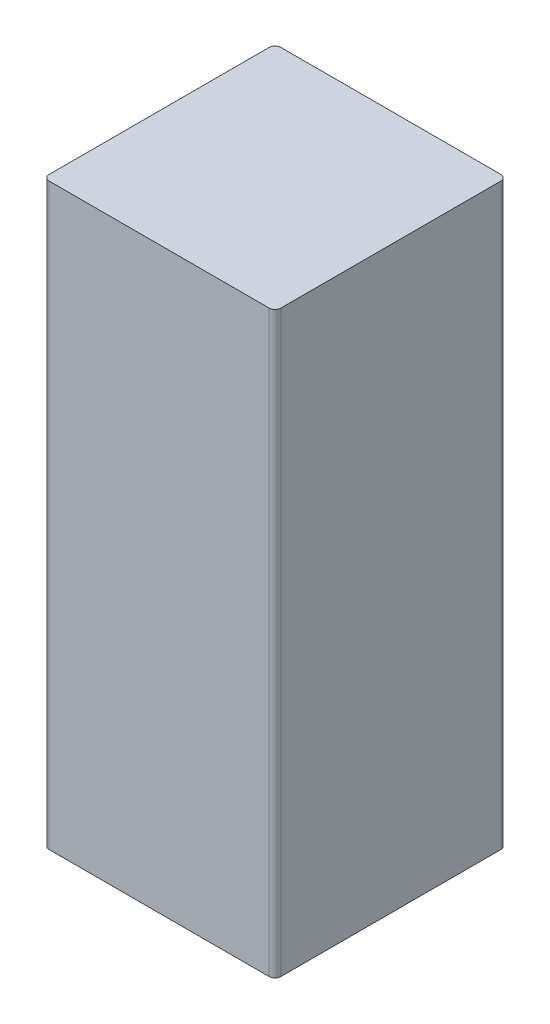
ISO-10303-21;
HEADER;
FILE_DESCRIPTION(('STEP AP214'),'2;1');
FILE_NAME('part.step','',(''),(''),'','','');
FILE_SCHEMA(('AUTOMOTIVE_DESIGN { 1 0 10303 214 1 1 1 1 }'));
ENDSEC;
DATA;
#1=APPLICATION_CONTEXT('core data for automotive mechanical design processes');
#2=APPLICATION_PROTOCOL_DEFINITION('international standard','automotive_design',2000,#1);
#3=PRODUCT_CONTEXT('',#1,'mechanical');
#4=PRODUCT('Part','Part','',(#3));
#5=PRODUCT_RELATED_PRODUCT_CATEGORY('part','',(#4));
#6=PRODUCT_DEFINITION_FORMATION('','',#4);
#7=PRODUCT_DEFINITION_CONTEXT('part definition',#1,'design');
#8=PRODUCT_DEFINITION('design','',#6,#7);
#9=PRODUCT_DEFINITION_SHAPE('','',#8);
#10=(LENGTH_UNIT() NAMED_UNIT(*) SI_UNIT(.MILLI.,.METRE.));
#11=(NAMED_UNIT(*) PLANE_ANGLE_UNIT() SI_UNIT($,.RADIAN.));
#12=(NAMED_UNIT(*) SI_UNIT($,.STERADIAN.) SOLID_ANGLE_UNIT());
#13=UNCERTAINTY_MEASURE_WITH_UNIT(LENGTH_MEASURE(1.E-05),#10,'distance_accuracy_value','');
#14=(GEOMETRIC_REPRESENTATION_CONTEXT(3) GLOBAL_UNCERTAINTY_ASSIGNED_CONTEXT((#13)) GLOBAL_UNIT_ASSIGNED_CONTEXT((#10,
#11,#12)) REPRESENTATION_CONTEXT('',''));
#15=CARTESIAN_POINT('',(0.,0.,0.));
#16=DIRECTION('',(0.,0.,1.));
#17=DIRECTION('',(1.,0.,0.));
#18=AXIS2_PLACEMENT_3D('',#15,#16,#17);
#19=CARTESIAN_POINT('',(1.90000000000002,10.,1.89999999999999));
#20=DIRECTION('',(0.,-1.,0.));
#21=DIRECTION('',(0.,0.,-1.));
#22=AXIS2_PLACEMENT_3D('',#19,#20,#21);
#23=CYLINDRICAL_SURFACE('',#22,0.1);
#24=CARTESIAN_POINT('',(1.90000000000002,0.,1.89999999999999));
#25=DIRECTION('',(0.,1.,0.));
#26=DIRECTION('',(0.,0.,1.));
#27=AXIS2_PLACEMENT_3D('',#24,#25,#26);
#28=CIRCLE('',#27,0.1);
#29=CARTESIAN_POINT('',(1.90000000000002,0.,1.99999999999999));
#30=VERTEX_POINT('',#29);
#31=CARTESIAN_POINT('',(2.00000000000002,0.,1.89999999999999));
#32=VERTEX_POINT('',#31);
#33=EDGE_CURVE('E140',#30,#32,#28,.T.);
#34=ORIENTED_EDGE('',*,*,#33,.T.);
#35=DIRECTION('',(0.,-1.,0.));
#36=VECTOR('',#35,1.);
#37=CARTESIAN_POINT('',(2.00000000000002,10.,1.89999999999999));
#38=LINE('',#37,#36);
#39=CARTESIAN_POINT('',(2.00000000000002,10.,1.89999999999999));
#40=VERTEX_POINT('',#39);
#41=EDGE_CURVE('E11',#40,#32,#38,.T.);
#42=ORIENTED_EDGE('',*,*,#41,.F.);
#43=CARTESIAN_POINT('',(1.90000000000002,10.,1.89999999999999));
#44=DIRECTION('',(0.,1.,0.));
#45=DIRECTION('',(0.,0.,1.));
#46=AXIS2_PLACEMENT_3D('',#43,#44,#45);
#47=CIRCLE('',#46,0.1);
#48=CARTESIAN_POINT('',(1.90000000000002,10.,1.99999999999999));
#49=VERTEX_POINT('',#48);
#50=EDGE_CURVE('E162',#49,#40,#47,.T.);
#51=ORIENTED_EDGE('',*,*,#50,.F.);
#52=DIRECTION('',(0.,-1.,0.));
#53=VECTOR('',#52,1.);
#54=CARTESIAN_POINT('',(1.90000000000002,10.,1.99999999999999));
#55=LINE('',#54,#53);
#56=EDGE_CURVE('E136',#49,#30,#55,.T.);
#57=ORIENTED_EDGE('',*,*,#56,.T.);
#58=EDGE_LOOP('',(#34,#42,#51,#57));
#59=FACE_BOUND('',#58,.T.);
#60=ADVANCED_FACE('F39',(#59),#23,.T.);
#61=CARTESIAN_POINT('',(2.00000000000002,10.,1.89999999999999));
#62=DIRECTION('',(-1.,0.,0.));
#63=DIRECTION('',(0.,0.,1.));
#64=AXIS2_PLACEMENT_3D('',#61,#62,#63);
#65=PLANE('',#64);
#66=DIRECTION('',(0.,0.,-1.));
#67=VECTOR('',#66,1.);
#68=CARTESIAN_POINT('',(2.00000000000002,0.,1.89999999999999));
#69=LINE('',#68,#67);
#70=CARTESIAN_POINT('',(2.00000000000002,0.,-1.90000000000001));
#71=VERTEX_POINT('',#70);
#72=EDGE_CURVE('E144',#32,#71,#69,.T.);
#73=ORIENTED_EDGE('',*,*,#72,.T.);
#74=DIRECTION('',(0.,-1.,0.));
#75=VECTOR('',#74,1.);
#76=CARTESIAN_POINT('',(2.00000000000002,10.,-1.90000000000001));
#77=LINE('',#76,#75);
#78=CARTESIAN_POINT('',(2.00000000000002,10.,-1.90000000000001));
#79=VERTEX_POINT('',#78);
#80=EDGE_CURVE('E48',#79,#71,#77,.T.);
#81=ORIENTED_EDGE('',*,*,#80,.F.);
#82=DIRECTION('',(0.,0.,-1.));
#83=VECTOR('',#82,1.);
#84=CARTESIAN_POINT('',(2.00000000000002,10.,1.89999999999999));
#85=LINE('',#84,#83);
#86=EDGE_CURVE('E99',#40,#79,#85,.T.);
#87=ORIENTED_EDGE('',*,*,#86,.F.);
#88=ORIENTED_EDGE('',*,*,#41,.T.);
#89=EDGE_LOOP('',(#73,#81,#87,#88));
#90=FACE_BOUND('',#89,.T.);
#91=ADVANCED_FACE('F208',(#90),#65,.F.);
#92=CARTESIAN_POINT('',(1.90000000000002,10.,-1.90000000000001));
#93=DIRECTION('',(0.,-1.,0.));
#94=DIRECTION('',(0.,0.,-1.));
#95=AXIS2_PLACEMENT_3D('',#92,#93,#94);
#96=CYLINDRICAL_SURFACE('',#95,0.1);
#97=CARTESIAN_POINT('',(1.90000000000002,0.,-1.90000000000001));
#98=DIRECTION('',(0.,1.,0.));
#99=DIRECTION('',(0.,0.,-1.));
#100=AXIS2_PLACEMENT_3D('',#97,#98,#99);
#101=CIRCLE('',#100,0.1);
#102=CARTESIAN_POINT('',(1.90000000000002,0.,-2.00000000000001));
#103=VERTEX_POINT('',#102);
#104=EDGE_CURVE('E147',#71,#103,#101,.T.);
#105=ORIENTED_EDGE('',*,*,#104,.T.);
#106=DIRECTION('',(0.,-1.,0.));
#107=VECTOR('',#106,1.);
#108=CARTESIAN_POINT('',(1.90000000000002,10.,-2.00000000000001));
#109=LINE('',#108,#107);
#110=CARTESIAN_POINT('',(1.90000000000002,10.,-2.00000000000001));
#111=VERTEX_POINT('',#110);
#112=EDGE_CURVE('E173',#111,#103,#109,.T.);
#113=ORIENTED_EDGE('',*,*,#112,.F.);
#114=CARTESIAN_POINT('',(1.90000000000002,10.,-1.90000000000001));
#115=DIRECTION('',(0.,1.,0.));
#116=DIRECTION('',(0.,0.,-1.));
#117=AXIS2_PLACEMENT_3D('',#114,#115,#116);
#118=CIRCLE('',#117,0.1);
#119=EDGE_CURVE('E183',#79,#111,#118,.T.);
#120=ORIENTED_EDGE('',*,*,#119,.F.);
#121=ORIENTED_EDGE('',*,*,#80,.T.);
#122=EDGE_LOOP('',(#105,#113,#120,#121));
#123=FACE_BOUND('',#122,.T.);
#124=ADVANCED_FACE('F181',(#123),#96,.T.);
#125=CARTESIAN_POINT('',(-1.89999999999998,10.,-2.00000000000001));
#126=DIRECTION('',(0.,0.,1.));
#127=DIRECTION('',(1.,0.,0.));
#128=AXIS2_PLACEMENT_3D('',#125,#126,#127);
#129=PLANE('',#128);
#130=DIRECTION('',(-1.,0.,0.));
#131=VECTOR('',#130,1.);
#132=CARTESIAN_POINT('',(-1.89999999999998,0.,-2.00000000000001));
#133=LINE('',#132,#131);
#134=CARTESIAN_POINT('',(-1.89999999999998,0.,-2.00000000000001));
#135=VERTEX_POINT('',#134);
#136=EDGE_CURVE('E150',#103,#135,#133,.T.);
#137=ORIENTED_EDGE('',*,*,#136,.T.);
#138=DIRECTION('',(0.,-1.,0.));
#139=VECTOR('',#138,1.);
#140=CARTESIAN_POINT('',(-1.89999999999998,10.,-2.00000000000001));
#141=LINE('',#140,#139);
#142=CARTESIAN_POINT('',(-1.89999999999998,10.,-2.00000000000001));
#143=VERTEX_POINT('',#142);
#144=EDGE_CURVE('E169',#143,#135,#141,.T.);
#145=ORIENTED_EDGE('',*,*,#144,.F.);
#146=DIRECTION('',(-1.,0.,0.));
#147=VECTOR('',#146,1.);
#148=CARTESIAN_POINT('',(-1.89999999999998,10.,-2.00000000000001));
#149=LINE('',#148,#147);
#150=EDGE_CURVE('E196',#111,#143,#149,.T.);
#151=ORIENTED_EDGE('',*,*,#150,.F.);
#152=ORIENTED_EDGE('',*,*,#112,.T.);
#153=EDGE_LOOP('',(#137,#145,#151,#152));
#154=FACE_BOUND('',#153,.T.);
#155=ADVANCED_FACE('F191',(#154),#129,.F.);
#156=CARTESIAN_POINT('',(-1.89999999999998,10.,-1.90000000000001));
#157=DIRECTION('',(0.,-1.,0.));
#158=DIRECTION('',(0.,0.,-1.));
#159=AXIS2_PLACEMENT_3D('',#156,#157,#158);
#160=CYLINDRICAL_SURFACE('',#159,0.1);
#161=CARTESIAN_POINT('',(-1.89999999999998,0.,-1.90000000000001));
#162=DIRECTION('',(0.,1.,0.));
#163=DIRECTION('',(0.,0.,-1.));
#164=AXIS2_PLACEMENT_3D('',#161,#162,#163);
#165=CIRCLE('',#164,0.1);
#166=CARTESIAN_POINT('',(-1.99999999999998,0.,-1.90000000000001));
#167=VERTEX_POINT('',#166);
#168=EDGE_CURVE('E153',#135,#167,#165,.T.);
#169=ORIENTED_EDGE('',*,*,#168,.T.);
#170=DIRECTION('',(0.,-1.,0.));
#171=VECTOR('',#170,1.);
#172=CARTESIAN_POINT('',(-1.99999999999998,10.,-1.90000000000001));
#173=LINE('',#172,#171);
#174=CARTESIAN_POINT('',(-1.99999999999998,10.,-1.90000000000001));
#175=VERTEX_POINT('',#174);
#176=EDGE_CURVE('E129',#175,#167,#173,.T.);
#177=ORIENTED_EDGE('',*,*,#176,.F.);
#178=CARTESIAN_POINT('',(-1.89999999999998,10.,-1.90000000000001));
#179=DIRECTION('',(0.,1.,0.));
#180=DIRECTION('',(0.,0.,-1.));
#181=AXIS2_PLACEMENT_3D('',#178,#179,#180);
#182=CIRCLE('',#181,0.1);
#183=EDGE_CURVE('E118',#143,#175,#182,.T.);
#184=ORIENTED_EDGE('',*,*,#183,.F.);
#185=ORIENTED_EDGE('',*,*,#144,.T.);
#186=EDGE_LOOP('',(#169,#177,#184,#185));
#187=FACE_BOUND('',#186,.T.);
#188=ADVANCED_FACE('F194',(#187),#160,.T.);
#189=CARTESIAN_POINT('',(-1.99999999999998,10.,1.89999999999999));
#190=DIRECTION('',(1.,0.,0.));
#191=DIRECTION('',(0.,0.,-1.));
#192=AXIS2_PLACEMENT_3D('',#189,#190,#191);
#193=PLANE('',#192);
#194=DIRECTION('',(0.,0.,1.));
#195=VECTOR('',#194,1.);
#196=CARTESIAN_POINT('',(-1.99999999999998,0.,1.89999999999999));
#197=LINE('',#196,#195);
#198=CARTESIAN_POINT('',(-1.99999999999998,0.,1.89999999999999));
#199=VERTEX_POINT('',#198);
#200=EDGE_CURVE('E127',#167,#199,#197,.T.);
#201=ORIENTED_EDGE('',*,*,#200,.T.);
#202=DIRECTION('',(0.,-1.,0.));
#203=VECTOR('',#202,1.);
#204=CARTESIAN_POINT('',(-1.99999999999998,10.,1.89999999999999));
#205=LINE('',#204,#203);
#206=CARTESIAN_POINT('',(-1.99999999999998,10.,1.89999999999999));
#207=VERTEX_POINT('',#206);
#208=EDGE_CURVE('E124',#207,#199,#205,.T.);
#209=ORIENTED_EDGE('',*,*,#208,.F.);
#210=DIRECTION('',(0.,0.,1.));
#211=VECTOR('',#210,1.);
#212=CARTESIAN_POINT('',(-1.99999999999998,10.,1.89999999999999));
#213=LINE('',#212,#211);
#214=EDGE_CURVE('E112',#175,#207,#213,.T.);
#215=ORIENTED_EDGE('',*,*,#214,.F.);
#216=ORIENTED_EDGE('',*,*,#176,.T.);
#217=EDGE_LOOP('',(#201,#209,#215,#216));
#218=FACE_BOUND('',#217,.T.);
#219=ADVANCED_FACE('F125',(#218),#193,.F.);
#220=CARTESIAN_POINT('',(-1.89999999999998,10.,1.89999999999999));
#221=DIRECTION('',(0.,-1.,0.));
#222=DIRECTION('',(0.,0.,-1.));
#223=AXIS2_PLACEMENT_3D('',#220,#221,#222);
#224=CYLINDRICAL_SURFACE('',#223,0.1);
#225=CARTESIAN_POINT('',(-1.89999999999998,0.,1.89999999999999));
#226=DIRECTION('',(0.,1.,0.));
#227=DIRECTION('',(0.,0.,-1.));
#228=AXIS2_PLACEMENT_3D('',#225,#226,#227);
#229=CIRCLE('',#228,0.1);
#230=CARTESIAN_POINT('',(-1.89999999999998,0.,1.99999999999999));
#231=VERTEX_POINT('',#230);
#232=EDGE_CURVE('E85',#199,#231,#229,.T.);
#233=ORIENTED_EDGE('',*,*,#232,.T.);
#234=DIRECTION('',(0.,-1.,0.));
#235=VECTOR('',#234,1.);
#236=CARTESIAN_POINT('',(-1.89999999999998,10.,1.99999999999999));
#237=LINE('',#236,#235);
#238=CARTESIAN_POINT('',(-1.89999999999998,10.,1.99999999999999));
#239=VERTEX_POINT('',#238);
#240=EDGE_CURVE('E130',#239,#231,#237,.T.);
#241=ORIENTED_EDGE('',*,*,#240,.F.);
#242=CARTESIAN_POINT('',(-1.89999999999998,10.,1.89999999999999));
#243=DIRECTION('',(0.,1.,0.));
#244=DIRECTION('',(0.,0.,-1.));
#245=AXIS2_PLACEMENT_3D('',#242,#243,#244);
#246=CIRCLE('',#245,0.1);
#247=EDGE_CURVE('E116',#207,#239,#246,.T.);
#248=ORIENTED_EDGE('',*,*,#247,.F.);
#249=ORIENTED_EDGE('',*,*,#208,.T.);
#250=EDGE_LOOP('',(#233,#241,#248,#249));
#251=FACE_BOUND('',#250,.T.);
#252=ADVANCED_FACE('F132',(#251),#224,.T.);
#253=CARTESIAN_POINT('',(-1.89999999999998,10.,1.99999999999999));
#254=DIRECTION('',(0.,0.,-1.));
#255=DIRECTION('',(-1.,0.,0.));
#256=AXIS2_PLACEMENT_3D('',#253,#254,#255);
#257=PLANE('',#256);
#258=DIRECTION('',(1.,0.,0.));
#259=VECTOR('',#258,1.);
#260=CARTESIAN_POINT('',(-1.89999999999998,0.,1.99999999999999));
#261=LINE('',#260,#259);
#262=EDGE_CURVE('E91',#231,#30,#261,.T.);
#263=ORIENTED_EDGE('',*,*,#262,.T.);
#264=ORIENTED_EDGE('',*,*,#56,.F.);
#265=DIRECTION('',(1.,0.,0.));
#266=VECTOR('',#265,1.);
#267=CARTESIAN_POINT('',(-1.89999999999998,10.,1.99999999999999));
#268=LINE('',#267,#266);
#269=EDGE_CURVE('E56',#239,#49,#268,.T.);
#270=ORIENTED_EDGE('',*,*,#269,.F.);
#271=ORIENTED_EDGE('',*,*,#240,.T.);
#272=EDGE_LOOP('',(#263,#264,#270,#271));
#273=FACE_BOUND('',#272,.T.);
#274=ADVANCED_FACE('F224',(#273),#257,.F.);
#275=CARTESIAN_POINT('',(1.90000000000002,10.,1.89999999999999));
#276=DIRECTION('',(0.,1.,0.));
#277=DIRECTION('',(0.,0.,1.));
#278=AXIS2_PLACEMENT_3D('',#275,#276,#277);
#279=PLANE('',#278);
#280=ORIENTED_EDGE('',*,*,#50,.T.);
#281=ORIENTED_EDGE('',*,*,#86,.T.);
#282=ORIENTED_EDGE('',*,*,#119,.T.);
#283=ORIENTED_EDGE('',*,*,#150,.T.);
#284=ORIENTED_EDGE('',*,*,#183,.T.);
#285=ORIENTED_EDGE('',*,*,#214,.T.);
#286=ORIENTED_EDGE('',*,*,#247,.T.);
#287=ORIENTED_EDGE('',*,*,#269,.T.);
#288=EDGE_LOOP('',(#280,#281,#282,#283,#284,#285,#286,#287));
#289=FACE_BOUND('',#288,.T.);
#290=ADVANCED_FACE('F114',(#289),#279,.T.);
#291=CARTESIAN_POINT('',(1.90000000000002,0.,1.89999999999999));
#292=DIRECTION('',(0.,1.,0.));
#293=DIRECTION('',(0.,0.,1.));
#294=AXIS2_PLACEMENT_3D('',#291,#292,#293);
#295=PLANE('',#294);
#296=ORIENTED_EDGE('',*,*,#33,.F.);
#297=ORIENTED_EDGE('',*,*,#262,.F.);
#298=ORIENTED_EDGE('',*,*,#232,.F.);
#299=ORIENTED_EDGE('',*,*,#200,.F.);
#300=ORIENTED_EDGE('',*,*,#168,.F.);
#301=ORIENTED_EDGE('',*,*,#136,.F.);
#302=ORIENTED_EDGE('',*,*,#104,.F.);
#303=ORIENTED_EDGE('',*,*,#72,.F.);
#304=EDGE_LOOP('',(#296,#297,#298,#299,#300,#301,#302,#303));
#305=FACE_BOUND('',#304,.T.);
#306=ADVANCED_FACE('F187',(#305),#295,.F.);
#307=CLOSED_SHELL('',(#60,#91,#124,#155,#188,#219,#252,#274,#290,#306));
#308=MANIFOLD_SOLID_BREP('B2',#307);
#309=ADVANCED_BREP_SHAPE_REPRESENTATION('',(#18,#308),#14);
#310=SHAPE_DEFINITION_REPRESENTATION(#9,#309);
ENDSEC;
END-ISO-10303-21;
